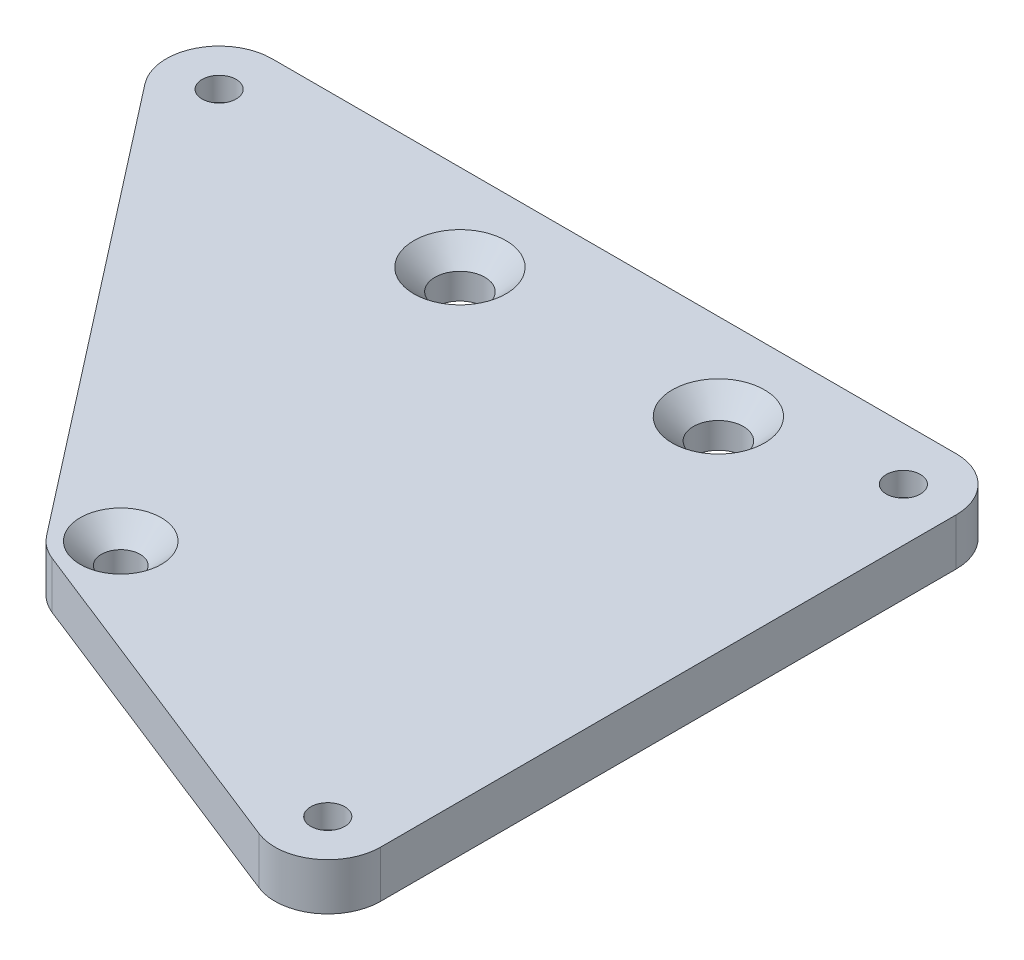
ISO-10303-21;
HEADER;
FILE_DESCRIPTION(('STEP AP214'),'2;1');
FILE_NAME('part.step','',(''),(''),'','','');
FILE_SCHEMA(('AUTOMOTIVE_DESIGN { 1 0 10303 214 1 1 1 1 }'));
ENDSEC;
DATA;
#1=APPLICATION_CONTEXT('core data for automotive mechanical design processes');
#2=APPLICATION_PROTOCOL_DEFINITION('international standard','automotive_design',2000,#1);
#3=PRODUCT_CONTEXT('',#1,'mechanical');
#4=PRODUCT('Part','Part','',(#3));
#5=PRODUCT_RELATED_PRODUCT_CATEGORY('part','',(#4));
#6=PRODUCT_DEFINITION_FORMATION('','',#4);
#7=PRODUCT_DEFINITION_CONTEXT('part definition',#1,'design');
#8=PRODUCT_DEFINITION('design','',#6,#7);
#9=PRODUCT_DEFINITION_SHAPE('','',#8);
#10=(LENGTH_UNIT() NAMED_UNIT(*) SI_UNIT(.MILLI.,.METRE.));
#11=(NAMED_UNIT(*) PLANE_ANGLE_UNIT() SI_UNIT($,.RADIAN.));
#12=(NAMED_UNIT(*) SI_UNIT($,.STERADIAN.) SOLID_ANGLE_UNIT());
#13=UNCERTAINTY_MEASURE_WITH_UNIT(LENGTH_MEASURE(1.E-05),#10,'distance_accuracy_value','');
#14=(GEOMETRIC_REPRESENTATION_CONTEXT(3) GLOBAL_UNCERTAINTY_ASSIGNED_CONTEXT((#13)) GLOBAL_UNIT_ASSIGNED_CONTEXT((#10,
#11,#12)) REPRESENTATION_CONTEXT('',''));
#15=CARTESIAN_POINT('',(0.,0.,0.));
#16=DIRECTION('',(0.,0.,1.));
#17=DIRECTION('',(1.,0.,0.));
#18=AXIS2_PLACEMENT_3D('',#15,#16,#17);
#19=CARTESIAN_POINT('',(29.125,-4.,-24.5));
#20=DIRECTION('',(0.,1.,0.));
#21=DIRECTION('',(0.,0.,1.));
#22=AXIS2_PLACEMENT_3D('',#19,#20,#21);
#23=CYLINDRICAL_SURFACE('',#22,3.);
#24=CARTESIAN_POINT('',(29.125,-4.,-24.5));
#25=DIRECTION('',(0.,1.,0.));
#26=DIRECTION('',(0.,0.,1.));
#27=AXIS2_PLACEMENT_3D('',#24,#25,#26);
#28=CIRCLE('',#27,3.);
#29=CARTESIAN_POINT('',(29.125,-4.,-21.5));
#30=VERTEX_POINT('',#29);
#31=EDGE_CURVE('E164',#30,#30,#28,.T.);
#32=ORIENTED_EDGE('',*,*,#31,.F.);
#33=EDGE_LOOP('',(#32));
#34=FACE_BOUND('',#33,.T.);
#35=CARTESIAN_POINT('',(29.125,-2.,-24.5));
#36=DIRECTION('',(0.,1.,0.));
#37=DIRECTION('',(0.,0.,1.));
#38=AXIS2_PLACEMENT_3D('',#35,#36,#37);
#39=CIRCLE('',#38,3.);
#40=CARTESIAN_POINT('',(29.125,-2.,-21.5));
#41=VERTEX_POINT('',#40);
#42=EDGE_CURVE('E181',#41,#41,#39,.F.);
#43=ORIENTED_EDGE('',*,*,#42,.F.);
#44=EDGE_LOOP('',(#43));
#45=FACE_BOUND('',#44,.T.);
#46=ADVANCED_FACE('F41',(#34,#45),#23,.F.);
#47=CARTESIAN_POINT('',(-29.125,-4.,-24.5));
#48=DIRECTION('',(0.,1.,0.));
#49=DIRECTION('',(0.,0.,1.));
#50=AXIS2_PLACEMENT_3D('',#47,#48,#49);
#51=CYLINDRICAL_SURFACE('',#50,3.);
#52=CARTESIAN_POINT('',(-29.125,-4.,-24.5));
#53=DIRECTION('',(0.,1.,0.));
#54=DIRECTION('',(0.,0.,1.));
#55=AXIS2_PLACEMENT_3D('',#52,#53,#54);
#56=CIRCLE('',#55,3.);
#57=CARTESIAN_POINT('',(-29.125,-4.,-21.5));
#58=VERTEX_POINT('',#57);
#59=EDGE_CURVE('E327',#58,#58,#56,.T.);
#60=ORIENTED_EDGE('',*,*,#59,.F.);
#61=EDGE_LOOP('',(#60));
#62=FACE_BOUND('',#61,.T.);
#63=CARTESIAN_POINT('',(-29.125,-2.,-24.5));
#64=DIRECTION('',(0.,1.,0.));
#65=DIRECTION('',(0.,0.,1.));
#66=AXIS2_PLACEMENT_3D('',#63,#64,#65);
#67=CIRCLE('',#66,3.);
#68=CARTESIAN_POINT('',(-29.125,-2.,-21.5));
#69=VERTEX_POINT('',#68);
#70=EDGE_CURVE('E178',#69,#69,#67,.F.);
#71=ORIENTED_EDGE('',*,*,#70,.F.);
#72=EDGE_LOOP('',(#71));
#73=FACE_BOUND('',#72,.T.);
#74=ADVANCED_FACE('F216',(#62,#73),#51,.F.);
#75=CARTESIAN_POINT('',(29.125,-4.,24.5));
#76=DIRECTION('',(0.,1.,0.));
#77=DIRECTION('',(0.,0.,1.));
#78=AXIS2_PLACEMENT_3D('',#75,#76,#77);
#79=CYLINDRICAL_SURFACE('',#78,3.);
#80=CARTESIAN_POINT('',(29.125,-4.,24.5));
#81=DIRECTION('',(0.,1.,0.));
#82=DIRECTION('',(0.,0.,1.));
#83=AXIS2_PLACEMENT_3D('',#80,#81,#82);
#84=CIRCLE('',#83,3.);
#85=CARTESIAN_POINT('',(29.125,-4.,27.5));
#86=VERTEX_POINT('',#85);
#87=EDGE_CURVE('E330',#86,#86,#84,.T.);
#88=ORIENTED_EDGE('',*,*,#87,.F.);
#89=EDGE_LOOP('',(#88));
#90=FACE_BOUND('',#89,.T.);
#91=CARTESIAN_POINT('',(29.125,-2.,24.5));
#92=DIRECTION('',(0.,1.,0.));
#93=DIRECTION('',(0.,0.,1.));
#94=AXIS2_PLACEMENT_3D('',#91,#92,#93);
#95=CIRCLE('',#94,3.);
#96=CARTESIAN_POINT('',(29.125,-2.,27.5));
#97=VERTEX_POINT('',#96);
#98=EDGE_CURVE('E166',#97,#97,#95,.F.);
#99=ORIENTED_EDGE('',*,*,#98,.F.);
#100=EDGE_LOOP('',(#99));
#101=FACE_BOUND('',#100,.T.);
#102=ADVANCED_FACE('F223',(#90,#101),#79,.F.);
#103=CARTESIAN_POINT('',(0.,-4.,-29.));
#104=DIRECTION('',(0.,0.,-1.));
#105=DIRECTION('',(-1.,0.,0.));
#106=AXIS2_PLACEMENT_3D('',#103,#104,#105);
#107=PLANE('',#106);
#108=DIRECTION('',(-1.,0.,0.));
#109=VECTOR('',#108,1.);
#110=CARTESIAN_POINT('',(0.,0.,-29.));
#111=LINE('',#110,#109);
#112=CARTESIAN_POINT('',(29.125,0.,-29.));
#113=VERTEX_POINT('',#112);
#114=CARTESIAN_POINT('',(-29.125,0.,-29.));
#115=VERTEX_POINT('',#114);
#116=EDGE_CURVE('E142',#113,#115,#111,.T.);
#117=ORIENTED_EDGE('',*,*,#116,.F.);
#118=DIRECTION('',(0.,1.,0.));
#119=VECTOR('',#118,1.);
#120=CARTESIAN_POINT('',(29.125,-4.,-29.));
#121=LINE('',#120,#119);
#122=CARTESIAN_POINT('',(29.125,-4.,-29.));
#123=VERTEX_POINT('',#122);
#124=EDGE_CURVE('E59',#123,#113,#121,.T.);
#125=ORIENTED_EDGE('',*,*,#124,.F.);
#126=DIRECTION('',(-1.,0.,0.));
#127=VECTOR('',#126,1.);
#128=CARTESIAN_POINT('',(0.,-4.,-29.));
#129=LINE('',#128,#127);
#130=CARTESIAN_POINT('',(-29.125,-4.,-29.));
#131=VERTEX_POINT('',#130);
#132=EDGE_CURVE('E342',#123,#131,#129,.T.);
#133=ORIENTED_EDGE('',*,*,#132,.T.);
#134=DIRECTION('',(0.,1.,0.));
#135=VECTOR('',#134,1.);
#136=CARTESIAN_POINT('',(-29.125,-4.,-29.));
#137=LINE('',#136,#135);
#138=EDGE_CURVE('E100',#131,#115,#137,.T.);
#139=ORIENTED_EDGE('',*,*,#138,.T.);
#140=EDGE_LOOP('',(#117,#125,#133,#139));
#141=FACE_BOUND('',#140,.T.);
#142=ADVANCED_FACE('F238',(#141),#107,.T.);
#143=CARTESIAN_POINT('',(29.125,-4.,-24.5));
#144=DIRECTION('',(0.,1.,0.));
#145=DIRECTION('',(0.,0.,1.));
#146=AXIS2_PLACEMENT_3D('',#143,#144,#145);
#147=CYLINDRICAL_SURFACE('',#146,4.50000000000001);
#148=CARTESIAN_POINT('',(29.125,0.,-24.5));
#149=DIRECTION('',(0.,1.,0.));
#150=DIRECTION('',(0.,0.,1.));
#151=AXIS2_PLACEMENT_3D('',#148,#149,#150);
#152=CIRCLE('',#151,4.50000000000001);
#153=CARTESIAN_POINT('',(33.625,0.,-24.5));
#154=VERTEX_POINT('',#153);
#155=EDGE_CURVE('E161',#154,#113,#152,.T.);
#156=ORIENTED_EDGE('',*,*,#155,.F.);
#157=DIRECTION('',(0.,1.,0.));
#158=VECTOR('',#157,1.);
#159=CARTESIAN_POINT('',(33.625,-4.,-24.5));
#160=LINE('',#159,#158);
#161=CARTESIAN_POINT('',(33.625,-4.,-24.5));
#162=VERTEX_POINT('',#161);
#163=EDGE_CURVE('E88',#162,#154,#160,.T.);
#164=ORIENTED_EDGE('',*,*,#163,.F.);
#165=CARTESIAN_POINT('',(29.125,-4.,-24.5));
#166=DIRECTION('',(0.,1.,0.));
#167=DIRECTION('',(0.,0.,1.));
#168=AXIS2_PLACEMENT_3D('',#165,#166,#167);
#169=CIRCLE('',#168,4.50000000000001);
#170=EDGE_CURVE('E132',#162,#123,#169,.T.);
#171=ORIENTED_EDGE('',*,*,#170,.T.);
#172=ORIENTED_EDGE('',*,*,#124,.T.);
#173=EDGE_LOOP('',(#156,#164,#171,#172));
#174=FACE_BOUND('',#173,.T.);
#175=ADVANCED_FACE('F254',(#174),#147,.T.);
#176=CARTESIAN_POINT('',(33.625,-4.,0.));
#177=DIRECTION('',(1.,0.,0.));
#178=DIRECTION('',(0.,0.,-1.));
#179=AXIS2_PLACEMENT_3D('',#176,#177,#178);
#180=PLANE('',#179);
#181=DIRECTION('',(0.,0.,-1.));
#182=VECTOR('',#181,1.);
#183=CARTESIAN_POINT('',(33.625,0.,0.));
#184=LINE('',#183,#182);
#185=CARTESIAN_POINT('',(33.625,0.,24.5));
#186=VERTEX_POINT('',#185);
#187=EDGE_CURVE('E119',#186,#154,#184,.T.);
#188=ORIENTED_EDGE('',*,*,#187,.F.);
#189=DIRECTION('',(0.,1.,0.));
#190=VECTOR('',#189,1.);
#191=CARTESIAN_POINT('',(33.625,-4.,24.5));
#192=LINE('',#191,#190);
#193=CARTESIAN_POINT('',(33.625,-4.,24.5));
#194=VERTEX_POINT('',#193);
#195=EDGE_CURVE('E114',#194,#186,#192,.T.);
#196=ORIENTED_EDGE('',*,*,#195,.F.);
#197=DIRECTION('',(0.,0.,-1.));
#198=VECTOR('',#197,1.);
#199=CARTESIAN_POINT('',(33.625,-4.,0.));
#200=LINE('',#199,#198);
#201=EDGE_CURVE('E117',#194,#162,#200,.T.);
#202=ORIENTED_EDGE('',*,*,#201,.T.);
#203=ORIENTED_EDGE('',*,*,#163,.T.);
#204=EDGE_LOOP('',(#188,#196,#202,#203));
#205=FACE_BOUND('',#204,.T.);
#206=ADVANCED_FACE('F116',(#205),#180,.T.);
#207=CARTESIAN_POINT('',(29.125,-4.,24.5));
#208=DIRECTION('',(0.,1.,0.));
#209=DIRECTION('',(0.,0.,1.));
#210=AXIS2_PLACEMENT_3D('',#207,#208,#209);
#211=CYLINDRICAL_SURFACE('',#210,4.5);
#212=CARTESIAN_POINT('',(29.125,0.,24.5));
#213=DIRECTION('',(0.,1.,0.));
#214=DIRECTION('',(0.,0.,1.));
#215=AXIS2_PLACEMENT_3D('',#212,#213,#214);
#216=CIRCLE('',#215,4.5);
#217=CARTESIAN_POINT('',(27.4723416023108,0.,28.6855370289304));
#218=VERTEX_POINT('',#217);
#219=EDGE_CURVE('E158',#218,#186,#216,.T.);
#220=ORIENTED_EDGE('',*,*,#219,.F.);
#221=DIRECTION('',(0.,1.,0.));
#222=VECTOR('',#221,1.);
#223=CARTESIAN_POINT('',(27.4723416023108,-4.,28.6855370289304));
#224=LINE('',#223,#222);
#225=CARTESIAN_POINT('',(27.4723416023108,-4.,28.6855370289304));
#226=VERTEX_POINT('',#225);
#227=EDGE_CURVE('E124',#226,#218,#224,.T.);
#228=ORIENTED_EDGE('',*,*,#227,.F.);
#229=CARTESIAN_POINT('',(29.125,-4.,24.5));
#230=DIRECTION('',(0.,1.,0.));
#231=DIRECTION('',(0.,0.,1.));
#232=AXIS2_PLACEMENT_3D('',#229,#230,#231);
#233=CIRCLE('',#232,4.5);
#234=EDGE_CURVE('E130',#226,#194,#233,.T.);
#235=ORIENTED_EDGE('',*,*,#234,.T.);
#236=ORIENTED_EDGE('',*,*,#195,.T.);
#237=EDGE_LOOP('',(#220,#228,#235,#236));
#238=FACE_BOUND('',#237,.T.);
#239=ADVANCED_FACE('F134',(#238),#211,.T.);
#240=CARTESIAN_POINT('',(-6.09337039552201,-4.,15.4321228495286));
#241=DIRECTION('',(-0.36725742170872,0.,0.930119339762303));
#242=DIRECTION('',(0.930119339762303,0.,0.36725742170872));
#243=AXIS2_PLACEMENT_3D('',#240,#241,#242);
#244=PLANE('',#243);
#245=DIRECTION('',(0.930119339762303,0.,0.36725742170872));
#246=VECTOR('',#245,1.);
#247=CARTESIAN_POINT('',(-6.09337039552201,0.,15.4321228495286));
#248=LINE('',#247,#246);
#249=CARTESIAN_POINT('',(-1.65265839768924,0.,17.1855370289304));
#250=VERTEX_POINT('',#249);
#251=EDGE_CURVE('E155',#250,#218,#248,.T.);
#252=ORIENTED_EDGE('',*,*,#251,.F.);
#253=DIRECTION('',(0.,1.,0.));
#254=VECTOR('',#253,1.);
#255=CARTESIAN_POINT('',(-1.65265839768924,-4.,17.1855370289304));
#256=LINE('',#255,#254);
#257=CARTESIAN_POINT('',(-1.65265839768924,-4.,17.1855370289304));
#258=VERTEX_POINT('',#257);
#259=EDGE_CURVE('E169',#258,#250,#256,.T.);
#260=ORIENTED_EDGE('',*,*,#259,.F.);
#261=DIRECTION('',(0.930119339762303,0.,0.36725742170872));
#262=VECTOR('',#261,1.);
#263=CARTESIAN_POINT('',(-6.09337039552201,-4.,15.4321228495286));
#264=LINE('',#263,#262);
#265=EDGE_CURVE('E135',#258,#226,#264,.T.);
#266=ORIENTED_EDGE('',*,*,#265,.T.);
#267=ORIENTED_EDGE('',*,*,#227,.T.);
#268=EDGE_LOOP('',(#252,#260,#266,#267));
#269=FACE_BOUND('',#268,.T.);
#270=ADVANCED_FACE('F263',(#269),#244,.T.);
#271=CARTESIAN_POINT('',(0.,-4.,13.));
#272=DIRECTION('',(0.,1.,0.));
#273=DIRECTION('',(0.,0.,1.));
#274=AXIS2_PLACEMENT_3D('',#271,#272,#273);
#275=CYLINDRICAL_SURFACE('',#274,4.5);
#276=CARTESIAN_POINT('',(0.,0.,13.));
#277=DIRECTION('',(0.,1.,0.));
#278=DIRECTION('',(0.,0.,1.));
#279=AXIS2_PLACEMENT_3D('',#276,#277,#278);
#280=CIRCLE('',#279,4.5);
#281=CARTESIAN_POINT('',(-3.55399781716934,0.,15.7602716380015));
#282=VERTEX_POINT('',#281);
#283=EDGE_CURVE('E152',#282,#250,#280,.T.);
#284=ORIENTED_EDGE('',*,*,#283,.F.);
#285=DIRECTION('',(0.,1.,0.));
#286=VECTOR('',#285,1.);
#287=CARTESIAN_POINT('',(-3.55399781716934,-4.,15.7602716380015));
#288=LINE('',#287,#286);
#289=CARTESIAN_POINT('',(-3.55399781716934,-4.,15.7602716380015));
#290=VERTEX_POINT('',#289);
#291=EDGE_CURVE('E171',#290,#282,#288,.T.);
#292=ORIENTED_EDGE('',*,*,#291,.F.);
#293=CARTESIAN_POINT('',(0.,-4.,13.));
#294=DIRECTION('',(0.,1.,0.));
#295=DIRECTION('',(0.,0.,1.));
#296=AXIS2_PLACEMENT_3D('',#293,#294,#295);
#297=CIRCLE('',#296,4.5);
#298=EDGE_CURVE('E137',#290,#258,#297,.T.);
#299=ORIENTED_EDGE('',*,*,#298,.T.);
#300=ORIENTED_EDGE('',*,*,#259,.T.);
#301=EDGE_LOOP('',(#284,#292,#299,#300));
#302=FACE_BOUND('',#301,.T.);
#303=ADVANCED_FACE('F259',(#302),#275,.T.);
#304=CARTESIAN_POINT('',(-9.85177519451619,-4.,7.65154540107424));
#305=DIRECTION('',(-0.789777292704297,0.,0.613393697333671));
#306=DIRECTION('',(0.613393697333671,0.,0.789777292704297));
#307=AXIS2_PLACEMENT_3D('',#304,#305,#306);
#308=PLANE('',#307);
#309=DIRECTION('',(0.613393697333671,0.,0.789777292704297));
#310=VECTOR('',#309,1.);
#311=CARTESIAN_POINT('',(-9.85177519451619,0.,7.65154540107424));
#312=LINE('',#311,#310);
#313=CARTESIAN_POINT('',(-32.6789978171693,0.,-21.7397283619985));
#314=VERTEX_POINT('',#313);
#315=EDGE_CURVE('E149',#314,#282,#312,.T.);
#316=ORIENTED_EDGE('',*,*,#315,.F.);
#317=DIRECTION('',(0.,1.,0.));
#318=VECTOR('',#317,1.);
#319=CARTESIAN_POINT('',(-32.6789978171693,-4.,-21.7397283619985));
#320=LINE('',#319,#318);
#321=CARTESIAN_POINT('',(-32.6789978171693,-4.,-21.7397283619985));
#322=VERTEX_POINT('',#321);
#323=EDGE_CURVE('E173',#322,#314,#320,.T.);
#324=ORIENTED_EDGE('',*,*,#323,.F.);
#325=DIRECTION('',(0.613393697333671,0.,0.789777292704297));
#326=VECTOR('',#325,1.);
#327=CARTESIAN_POINT('',(-9.85177519451619,-4.,7.65154540107424));
#328=LINE('',#327,#326);
#329=EDGE_CURVE('E346',#322,#290,#328,.T.);
#330=ORIENTED_EDGE('',*,*,#329,.T.);
#331=ORIENTED_EDGE('',*,*,#291,.T.);
#332=EDGE_LOOP('',(#316,#324,#330,#331));
#333=FACE_BOUND('',#332,.T.);
#334=ADVANCED_FACE('F250',(#333),#308,.T.);
#335=CARTESIAN_POINT('',(0.,-4.,13.));
#336=DIRECTION('',(0.,1.,0.));
#337=DIRECTION('',(0.,0.,1.));
#338=AXIS2_PLACEMENT_3D('',#335,#336,#337);
#339=CYLINDRICAL_SURFACE('',#338,1.65);
#340=CARTESIAN_POINT('',(0.,-1.8,13.));
#341=DIRECTION('',(0.,1.,0.));
#342=DIRECTION('',(0.,0.,1.));
#343=AXIS2_PLACEMENT_3D('',#340,#341,#342);
#344=CIRCLE('',#343,1.65);
#345=CARTESIAN_POINT('',(0.,-1.8,14.65));
#346=VERTEX_POINT('',#345);
#347=EDGE_CURVE('E184',#346,#346,#344,.T.);
#348=ORIENTED_EDGE('',*,*,#347,.T.);
#349=EDGE_LOOP('',(#348));
#350=FACE_BOUND('',#349,.T.);
#351=CARTESIAN_POINT('',(0.,-4.,13.));
#352=DIRECTION('',(0.,1.,0.));
#353=DIRECTION('',(0.,0.,1.));
#354=AXIS2_PLACEMENT_3D('',#351,#352,#353);
#355=CIRCLE('',#354,1.65);
#356=CARTESIAN_POINT('',(0.,-4.,14.65));
#357=VERTEX_POINT('',#356);
#358=EDGE_CURVE('E339',#357,#357,#355,.T.);
#359=ORIENTED_EDGE('',*,*,#358,.F.);
#360=EDGE_LOOP('',(#359));
#361=FACE_BOUND('',#360,.T.);
#362=ADVANCED_FACE('F247',(#350,#361),#339,.F.);
#363=CARTESIAN_POINT('',(-5.74999999999999,-4.,-21.625));
#364=DIRECTION('',(0.,1.,0.));
#365=DIRECTION('',(0.,0.,1.));
#366=AXIS2_PLACEMENT_3D('',#363,#364,#365);
#367=CYLINDRICAL_SURFACE('',#366,2.125);
#368=CARTESIAN_POINT('',(-5.74999999999999,-1.80000000000002,-21.625));
#369=DIRECTION('',(0.,1.,0.));
#370=DIRECTION('',(0.,0.,1.));
#371=AXIS2_PLACEMENT_3D('',#368,#369,#370);
#372=CIRCLE('',#371,2.125);
#373=CARTESIAN_POINT('',(-5.74999999999999,-1.80000000000002,-19.5));
#374=VERTEX_POINT('',#373);
#375=EDGE_CURVE('E51',#374,#374,#372,.T.);
#376=ORIENTED_EDGE('',*,*,#375,.T.);
#377=EDGE_LOOP('',(#376));
#378=FACE_BOUND('',#377,.T.);
#379=CARTESIAN_POINT('',(-5.74999999999999,-4.,-21.625));
#380=DIRECTION('',(0.,1.,0.));
#381=DIRECTION('',(0.,0.,1.));
#382=AXIS2_PLACEMENT_3D('',#379,#380,#381);
#383=CIRCLE('',#382,2.125);
#384=CARTESIAN_POINT('',(-5.74999999999999,-4.,-19.5));
#385=VERTEX_POINT('',#384);
#386=EDGE_CURVE('E336',#385,#385,#383,.T.);
#387=ORIENTED_EDGE('',*,*,#386,.F.);
#388=EDGE_LOOP('',(#387));
#389=FACE_BOUND('',#388,.T.);
#390=ADVANCED_FACE('F198',(#378,#389),#367,.F.);
#391=CARTESIAN_POINT('',(16.25,-4.,-21.625));
#392=DIRECTION('',(0.,1.,0.));
#393=DIRECTION('',(0.,0.,1.));
#394=AXIS2_PLACEMENT_3D('',#391,#392,#393);
#395=CYLINDRICAL_SURFACE('',#394,2.125);
#396=CARTESIAN_POINT('',(16.25,-1.80000000000002,-21.625));
#397=DIRECTION('',(0.,1.,0.));
#398=DIRECTION('',(0.,0.,1.));
#399=AXIS2_PLACEMENT_3D('',#396,#397,#398);
#400=CIRCLE('',#399,2.125);
#401=CARTESIAN_POINT('',(16.25,-1.80000000000002,-19.5));
#402=VERTEX_POINT('',#401);
#403=EDGE_CURVE('E11',#402,#402,#400,.T.);
#404=ORIENTED_EDGE('',*,*,#403,.T.);
#405=EDGE_LOOP('',(#404));
#406=FACE_BOUND('',#405,.T.);
#407=CARTESIAN_POINT('',(16.25,-4.,-21.625));
#408=DIRECTION('',(0.,1.,0.));
#409=DIRECTION('',(0.,0.,1.));
#410=AXIS2_PLACEMENT_3D('',#407,#408,#409);
#411=CIRCLE('',#410,2.125);
#412=CARTESIAN_POINT('',(16.25,-4.,-19.5));
#413=VERTEX_POINT('',#412);
#414=EDGE_CURVE('E333',#413,#413,#411,.T.);
#415=ORIENTED_EDGE('',*,*,#414,.F.);
#416=EDGE_LOOP('',(#415));
#417=FACE_BOUND('',#416,.T.);
#418=ADVANCED_FACE('F240',(#406,#417),#395,.F.);
#419=CARTESIAN_POINT('',(-29.125,-4.,-24.5));
#420=DIRECTION('',(0.,1.,0.));
#421=DIRECTION('',(0.,0.,1.));
#422=AXIS2_PLACEMENT_3D('',#419,#420,#421);
#423=CYLINDRICAL_SURFACE('',#422,4.5);
#424=CARTESIAN_POINT('',(-29.125,0.,-24.5));
#425=DIRECTION('',(0.,1.,0.));
#426=DIRECTION('',(0.,0.,1.));
#427=AXIS2_PLACEMENT_3D('',#424,#425,#426);
#428=CIRCLE('',#427,4.5);
#429=EDGE_CURVE('E145',#115,#314,#428,.T.);
#430=ORIENTED_EDGE('',*,*,#429,.F.);
#431=ORIENTED_EDGE('',*,*,#138,.F.);
#432=CARTESIAN_POINT('',(-29.125,-4.,-24.5));
#433=DIRECTION('',(0.,1.,0.));
#434=DIRECTION('',(0.,0.,1.));
#435=AXIS2_PLACEMENT_3D('',#432,#433,#434);
#436=CIRCLE('',#435,4.5);
#437=EDGE_CURVE('E344',#131,#322,#436,.T.);
#438=ORIENTED_EDGE('',*,*,#437,.T.);
#439=ORIENTED_EDGE('',*,*,#323,.T.);
#440=EDGE_LOOP('',(#430,#431,#438,#439));
#441=FACE_BOUND('',#440,.T.);
#442=ADVANCED_FACE('F243',(#441),#423,.T.);
#443=CARTESIAN_POINT('',(0.,-4.,0.));
#444=DIRECTION('',(0.,1.,0.));
#445=DIRECTION('',(0.,0.,1.));
#446=AXIS2_PLACEMENT_3D('',#443,#444,#445);
#447=PLANE('',#446);
#448=ORIENTED_EDGE('',*,*,#31,.T.);
#449=EDGE_LOOP('',(#448));
#450=FACE_BOUND('',#449,.T.);
#451=ORIENTED_EDGE('',*,*,#59,.T.);
#452=EDGE_LOOP('',(#451));
#453=FACE_BOUND('',#452,.T.);
#454=ORIENTED_EDGE('',*,*,#87,.T.);
#455=EDGE_LOOP('',(#454));
#456=FACE_BOUND('',#455,.T.);
#457=ORIENTED_EDGE('',*,*,#414,.T.);
#458=EDGE_LOOP('',(#457));
#459=FACE_BOUND('',#458,.T.);
#460=ORIENTED_EDGE('',*,*,#386,.T.);
#461=EDGE_LOOP('',(#460));
#462=FACE_BOUND('',#461,.T.);
#463=ORIENTED_EDGE('',*,*,#358,.T.);
#464=EDGE_LOOP('',(#463));
#465=FACE_BOUND('',#464,.T.);
#466=ORIENTED_EDGE('',*,*,#132,.F.);
#467=ORIENTED_EDGE('',*,*,#170,.F.);
#468=ORIENTED_EDGE('',*,*,#201,.F.);
#469=ORIENTED_EDGE('',*,*,#234,.F.);
#470=ORIENTED_EDGE('',*,*,#265,.F.);
#471=ORIENTED_EDGE('',*,*,#298,.F.);
#472=ORIENTED_EDGE('',*,*,#329,.F.);
#473=ORIENTED_EDGE('',*,*,#437,.F.);
#474=EDGE_LOOP('',(#466,#467,#468,#469,#470,#471,#472,#473));
#475=FACE_BOUND('',#474,.T.);
#476=ADVANCED_FACE('F128',(#450,#453,#456,#459,#462,#465,#475),#447,.F.);
#477=CARTESIAN_POINT('',(0.,0.,0.));
#478=DIRECTION('',(0.,1.,0.));
#479=DIRECTION('',(0.,0.,1.));
#480=AXIS2_PLACEMENT_3D('',#477,#478,#479);
#481=PLANE('',#480);
#482=CARTESIAN_POINT('',(0.,0.,13.));
#483=DIRECTION('',(0.,1.,0.));
#484=DIRECTION('',(0.,0.,1.));
#485=AXIS2_PLACEMENT_3D('',#482,#483,#484);
#486=CIRCLE('',#485,3.45000000000001);
#487=CARTESIAN_POINT('',(0.,0.,16.45));
#488=VERTEX_POINT('',#487);
#489=EDGE_CURVE('E193',#488,#488,#486,.F.);
#490=ORIENTED_EDGE('',*,*,#489,.T.);
#491=EDGE_LOOP('',(#490));
#492=FACE_BOUND('',#491,.T.);
#493=CARTESIAN_POINT('',(-5.74999999999999,0.,-21.625));
#494=DIRECTION('',(0.,1.,0.));
#495=DIRECTION('',(0.,0.,1.));
#496=AXIS2_PLACEMENT_3D('',#493,#494,#495);
#497=CIRCLE('',#496,3.92500000000001);
#498=CARTESIAN_POINT('',(-5.74999999999999,0.,-17.7));
#499=VERTEX_POINT('',#498);
#500=EDGE_CURVE('E190',#499,#499,#497,.F.);
#501=ORIENTED_EDGE('',*,*,#500,.T.);
#502=EDGE_LOOP('',(#501));
#503=FACE_BOUND('',#502,.T.);
#504=CARTESIAN_POINT('',(16.25,0.,-21.625));
#505=DIRECTION('',(0.,1.,0.));
#506=DIRECTION('',(0.,0.,1.));
#507=AXIS2_PLACEMENT_3D('',#504,#505,#506);
#508=CIRCLE('',#507,3.92500000000002);
#509=CARTESIAN_POINT('',(16.25,0.,-17.7));
#510=VERTEX_POINT('',#509);
#511=EDGE_CURVE('E187',#510,#510,#508,.F.);
#512=ORIENTED_EDGE('',*,*,#511,.T.);
#513=EDGE_LOOP('',(#512));
#514=FACE_BOUND('',#513,.T.);
#515=ORIENTED_EDGE('',*,*,#116,.T.);
#516=ORIENTED_EDGE('',*,*,#429,.T.);
#517=ORIENTED_EDGE('',*,*,#315,.T.);
#518=ORIENTED_EDGE('',*,*,#283,.T.);
#519=ORIENTED_EDGE('',*,*,#251,.T.);
#520=ORIENTED_EDGE('',*,*,#219,.T.);
#521=ORIENTED_EDGE('',*,*,#187,.T.);
#522=ORIENTED_EDGE('',*,*,#155,.T.);
#523=EDGE_LOOP('',(#515,#516,#517,#518,#519,#520,#521,#522));
#524=FACE_BOUND('',#523,.T.);
#525=CARTESIAN_POINT('',(29.125,0.,24.5));
#526=DIRECTION('',(0.,1.,0.));
#527=DIRECTION('',(0.,0.,1.));
#528=AXIS2_PLACEMENT_3D('',#525,#526,#527);
#529=CIRCLE('',#528,1.45);
#530=CARTESIAN_POINT('',(29.125,0.,25.95));
#531=VERTEX_POINT('',#530);
#532=EDGE_CURVE('E319',#531,#531,#529,.T.);
#533=ORIENTED_EDGE('',*,*,#532,.F.);
#534=EDGE_LOOP('',(#533));
#535=FACE_BOUND('',#534,.T.);
#536=CARTESIAN_POINT('',(-29.125,0.,-24.5));
#537=DIRECTION('',(0.,1.,0.));
#538=DIRECTION('',(0.,0.,1.));
#539=AXIS2_PLACEMENT_3D('',#536,#537,#538);
#540=CIRCLE('',#539,1.45);
#541=CARTESIAN_POINT('',(-29.125,0.,-23.05));
#542=VERTEX_POINT('',#541);
#543=EDGE_CURVE('E309',#542,#542,#540,.T.);
#544=ORIENTED_EDGE('',*,*,#543,.F.);
#545=EDGE_LOOP('',(#544));
#546=FACE_BOUND('',#545,.T.);
#547=CARTESIAN_POINT('',(29.125,0.,-24.5));
#548=DIRECTION('',(0.,1.,0.));
#549=DIRECTION('',(0.,0.,1.));
#550=AXIS2_PLACEMENT_3D('',#547,#548,#549);
#551=CIRCLE('',#550,1.45);
#552=CARTESIAN_POINT('',(29.125,0.,-23.05));
#553=VERTEX_POINT('',#552);
#554=EDGE_CURVE('E310',#553,#553,#551,.T.);
#555=ORIENTED_EDGE('',*,*,#554,.F.);
#556=EDGE_LOOP('',(#555));
#557=FACE_BOUND('',#556,.T.);
#558=ADVANCED_FACE('F274',(#492,#503,#514,#524,#535,#546,#557),#481,.T.);
#559=CARTESIAN_POINT('',(29.125,-2.,24.5));
#560=DIRECTION('',(0.,1.,0.));
#561=DIRECTION('',(0.,0.,1.));
#562=AXIS2_PLACEMENT_3D('',#559,#560,#561);
#563=CYLINDRICAL_SURFACE('',#562,1.45);
#564=CARTESIAN_POINT('',(29.125,-2.,24.5));
#565=DIRECTION('',(0.,1.,0.));
#566=DIRECTION('',(0.,0.,1.));
#567=AXIS2_PLACEMENT_3D('',#564,#565,#566);
#568=CIRCLE('',#567,1.45);
#569=CARTESIAN_POINT('',(29.125,-2.,25.95));
#570=VERTEX_POINT('',#569);
#571=EDGE_CURVE('E146',#570,#570,#568,.T.);
#572=ORIENTED_EDGE('',*,*,#571,.F.);
#573=EDGE_LOOP('',(#572));
#574=FACE_BOUND('',#573,.T.);
#575=ORIENTED_EDGE('',*,*,#532,.T.);
#576=EDGE_LOOP('',(#575));
#577=FACE_BOUND('',#576,.T.);
#578=ADVANCED_FACE('F277',(#574,#577),#563,.F.);
#579=CARTESIAN_POINT('',(0.,-2.,0.));
#580=DIRECTION('',(0.,1.,0.));
#581=DIRECTION('',(0.,0.,1.));
#582=AXIS2_PLACEMENT_3D('',#579,#580,#581);
#583=PLANE('',#582);
#584=ORIENTED_EDGE('',*,*,#571,.T.);
#585=EDGE_LOOP('',(#584));
#586=FACE_BOUND('',#585,.T.);
#587=ORIENTED_EDGE('',*,*,#98,.T.);
#588=EDGE_LOOP('',(#587));
#589=FACE_BOUND('',#588,.T.);
#590=ADVANCED_FACE('F283',(#586,#589),#583,.F.);
#591=CARTESIAN_POINT('',(-29.125,-2.,-24.5));
#592=DIRECTION('',(0.,1.,0.));
#593=DIRECTION('',(0.,0.,1.));
#594=AXIS2_PLACEMENT_3D('',#591,#592,#593);
#595=CYLINDRICAL_SURFACE('',#594,1.45);
#596=CARTESIAN_POINT('',(-29.125,-2.,-24.5));
#597=DIRECTION('',(0.,1.,0.));
#598=DIRECTION('',(0.,0.,1.));
#599=AXIS2_PLACEMENT_3D('',#596,#597,#598);
#600=CIRCLE('',#599,1.45);
#601=CARTESIAN_POINT('',(-29.125,-2.,-23.05));
#602=VERTEX_POINT('',#601);
#603=EDGE_CURVE('E313',#602,#602,#600,.T.);
#604=ORIENTED_EDGE('',*,*,#603,.F.);
#605=EDGE_LOOP('',(#604));
#606=FACE_BOUND('',#605,.T.);
#607=ORIENTED_EDGE('',*,*,#543,.T.);
#608=EDGE_LOOP('',(#607));
#609=FACE_BOUND('',#608,.T.);
#610=ADVANCED_FACE('F287',(#606,#609),#595,.F.);
#611=CARTESIAN_POINT('',(0.,-2.,0.));
#612=DIRECTION('',(0.,1.,0.));
#613=DIRECTION('',(0.,0.,1.));
#614=AXIS2_PLACEMENT_3D('',#611,#612,#613);
#615=PLANE('',#614);
#616=ORIENTED_EDGE('',*,*,#603,.T.);
#617=EDGE_LOOP('',(#616));
#618=FACE_BOUND('',#617,.T.);
#619=ORIENTED_EDGE('',*,*,#70,.T.);
#620=EDGE_LOOP('',(#619));
#621=FACE_BOUND('',#620,.T.);
#622=ADVANCED_FACE('F291',(#618,#621),#615,.F.);
#623=CARTESIAN_POINT('',(29.125,-2.,-24.5));
#624=DIRECTION('',(0.,1.,0.));
#625=DIRECTION('',(0.,0.,1.));
#626=AXIS2_PLACEMENT_3D('',#623,#624,#625);
#627=CYLINDRICAL_SURFACE('',#626,1.45);
#628=CARTESIAN_POINT('',(29.125,-2.,-24.5));
#629=DIRECTION('',(0.,1.,0.));
#630=DIRECTION('',(0.,0.,1.));
#631=AXIS2_PLACEMENT_3D('',#628,#629,#630);
#632=CIRCLE('',#631,1.45);
#633=CARTESIAN_POINT('',(29.125,-2.,-23.05));
#634=VERTEX_POINT('',#633);
#635=EDGE_CURVE('E307',#634,#634,#632,.T.);
#636=ORIENTED_EDGE('',*,*,#635,.F.);
#637=EDGE_LOOP('',(#636));
#638=FACE_BOUND('',#637,.T.);
#639=ORIENTED_EDGE('',*,*,#554,.T.);
#640=EDGE_LOOP('',(#639));
#641=FACE_BOUND('',#640,.T.);
#642=ADVANCED_FACE('F295',(#638,#641),#627,.F.);
#643=CARTESIAN_POINT('',(0.,-2.,0.));
#644=DIRECTION('',(0.,1.,0.));
#645=DIRECTION('',(0.,0.,1.));
#646=AXIS2_PLACEMENT_3D('',#643,#644,#645);
#647=PLANE('',#646);
#648=ORIENTED_EDGE('',*,*,#635,.T.);
#649=EDGE_LOOP('',(#648));
#650=FACE_BOUND('',#649,.T.);
#651=ORIENTED_EDGE('',*,*,#42,.T.);
#652=EDGE_LOOP('',(#651));
#653=FACE_BOUND('',#652,.T.);
#654=ADVANCED_FACE('F210',(#650,#653),#647,.F.);
#655=CARTESIAN_POINT('',(0.,-1.8,13.));
#656=DIRECTION('',(0.,1.,0.));
#657=DIRECTION('',(0.,0.,1.));
#658=AXIS2_PLACEMENT_3D('',#655,#656,#657);
#659=CONICAL_SURFACE('',#658,1.65,0.78539816339745);
#660=ORIENTED_EDGE('',*,*,#489,.F.);
#661=EDGE_LOOP('',(#660));
#662=FACE_BOUND('',#661,.T.);
#663=ORIENTED_EDGE('',*,*,#347,.F.);
#664=EDGE_LOOP('',(#663));
#665=FACE_BOUND('',#664,.T.);
#666=ADVANCED_FACE('F203',(#662,#665),#659,.F.);
#667=CARTESIAN_POINT('',(-5.74999999999999,-1.80000000000002,-21.625));
#668=DIRECTION('',(0.,1.,0.));
#669=DIRECTION('',(0.,0.,1.));
#670=AXIS2_PLACEMENT_3D('',#667,#668,#669);
#671=CONICAL_SURFACE('',#670,2.125,0.785398163397446);
#672=CARTESIAN_POINT('',(-5.74999999999999,0.,-17.7));
#673=CARTESIAN_POINT('',(-5.74999999999999,-0.0187500000000003,-17.71875));
#674=CARTESIAN_POINT('',(-5.74999999999999,-0.0375000000000005,-17.7375));
#675=CARTESIAN_POINT('',(-5.74999999999999,-0.075000000000001,-17.775));
#676=CARTESIAN_POINT('',(-5.74999999999999,-0.0937500000000012,-17.79375));
#677=CARTESIAN_POINT('',(-5.74999999999999,-0.131250000000001,-17.83125));
#678=CARTESIAN_POINT('',(-5.74999999999999,-0.150000000000001,-17.85));
#679=CARTESIAN_POINT('',(-5.74999999999999,-0.187500000000002,-17.8875));
#680=CARTESIAN_POINT('',(-5.74999999999999,-0.206250000000002,-17.90625));
#681=CARTESIAN_POINT('',(-5.74999999999999,-0.243750000000003,-17.94375));
#682=CARTESIAN_POINT('',(-5.74999999999999,-0.262500000000003,-17.9625));
#683=CARTESIAN_POINT('',(-5.74999999999999,-0.300000000000003,-18.));
#684=CARTESIAN_POINT('',(-5.74999999999999,-0.318750000000003,-18.01875));
#685=CARTESIAN_POINT('',(-5.74999999999999,-0.356250000000004,-18.05625));
#686=CARTESIAN_POINT('',(-5.74999999999999,-0.375000000000004,-18.075));
#687=CARTESIAN_POINT('',(-5.74999999999999,-0.412500000000004,-18.1125));
#688=CARTESIAN_POINT('',(-5.74999999999999,-0.431250000000004,-18.13125));
#689=CARTESIAN_POINT('',(-5.74999999999999,-0.468750000000005,-18.16875));
#690=CARTESIAN_POINT('',(-5.74999999999999,-0.487500000000005,-18.1875));
#691=CARTESIAN_POINT('',(-5.74999999999999,-0.525000000000005,-18.225));
#692=CARTESIAN_POINT('',(-5.74999999999999,-0.543750000000005,-18.24375));
#693=CARTESIAN_POINT('',(-5.74999999999999,-0.581250000000006,-18.28125));
#694=CARTESIAN_POINT('',(-5.74999999999999,-0.600000000000006,-18.3));
#695=CARTESIAN_POINT('',(-5.74999999999999,-0.637500000000006,-18.3375));
#696=CARTESIAN_POINT('',(-5.74999999999999,-0.656250000000006,-18.35625));
#697=CARTESIAN_POINT('',(-5.74999999999999,-0.693750000000007,-18.39375));
#698=CARTESIAN_POINT('',(-5.74999999999999,-0.712500000000007,-18.4125));
#699=CARTESIAN_POINT('',(-5.74999999999999,-0.750000000000008,-18.45));
#700=CARTESIAN_POINT('',(-5.74999999999999,-0.768750000000007,-18.46875));
#701=CARTESIAN_POINT('',(-5.74999999999999,-0.806250000000008,-18.50625));
#702=CARTESIAN_POINT('',(-5.74999999999999,-0.825000000000008,-18.525));
#703=CARTESIAN_POINT('',(-5.74999999999999,-0.862500000000008,-18.5625));
#704=CARTESIAN_POINT('',(-5.74999999999999,-0.881250000000008,-18.58125));
#705=CARTESIAN_POINT('',(-5.74999999999999,-0.918750000000009,-18.61875));
#706=CARTESIAN_POINT('',(-5.74999999999999,-0.937500000000009,-18.6375));
#707=CARTESIAN_POINT('',(-5.74999999999999,-0.975000000000009,-18.675));
#708=CARTESIAN_POINT('',(-5.74999999999999,-0.993750000000009,-18.69375));
#709=CARTESIAN_POINT('',(-5.74999999999999,-1.03125000000001,-18.73125));
#710=CARTESIAN_POINT('',(-5.74999999999999,-1.05000000000001,-18.75));
#711=CARTESIAN_POINT('',(-5.74999999999999,-1.08750000000001,-18.7875));
#712=CARTESIAN_POINT('',(-5.74999999999999,-1.10625000000001,-18.80625));
#713=CARTESIAN_POINT('',(-5.74999999999999,-1.14375000000001,-18.84375));
#714=CARTESIAN_POINT('',(-5.74999999999999,-1.16250000000001,-18.8625));
#715=CARTESIAN_POINT('',(-5.74999999999999,-1.20000000000001,-18.9));
#716=CARTESIAN_POINT('',(-5.74999999999999,-1.21875000000001,-18.91875));
#717=CARTESIAN_POINT('',(-5.74999999999999,-1.25625000000001,-18.95625));
#718=CARTESIAN_POINT('',(-5.74999999999999,-1.27500000000001,-18.975));
#719=CARTESIAN_POINT('',(-5.74999999999999,-1.31250000000001,-19.0125));
#720=CARTESIAN_POINT('',(-5.74999999999999,-1.33125000000001,-19.03125));
#721=CARTESIAN_POINT('',(-5.74999999999999,-1.36875000000001,-19.06875));
#722=CARTESIAN_POINT('',(-5.74999999999999,-1.38750000000001,-19.0875));
#723=CARTESIAN_POINT('',(-5.74999999999999,-1.42500000000001,-19.125));
#724=CARTESIAN_POINT('',(-5.74999999999999,-1.44375000000001,-19.14375));
#725=CARTESIAN_POINT('',(-5.74999999999999,-1.48125000000001,-19.18125));
#726=CARTESIAN_POINT('',(-5.74999999999999,-1.50000000000001,-19.2));
#727=CARTESIAN_POINT('',(-5.74999999999999,-1.53750000000001,-19.2375));
#728=CARTESIAN_POINT('',(-5.74999999999999,-1.55625000000001,-19.25625));
#729=CARTESIAN_POINT('',(-5.74999999999999,-1.59375000000002,-19.29375));
#730=CARTESIAN_POINT('',(-5.74999999999999,-1.61250000000002,-19.3125));
#731=CARTESIAN_POINT('',(-5.74999999999999,-1.65000000000002,-19.35));
#732=CARTESIAN_POINT('',(-5.74999999999999,-1.66875000000002,-19.36875));
#733=CARTESIAN_POINT('',(-5.74999999999999,-1.70625000000002,-19.40625));
#734=CARTESIAN_POINT('',(-5.74999999999999,-1.72500000000002,-19.425));
#735=CARTESIAN_POINT('',(-5.74999999999999,-1.76250000000002,-19.4625));
#736=CARTESIAN_POINT('',(-5.74999999999999,-1.78125000000002,-19.48125));
#737=CARTESIAN_POINT('',(-5.74999999999999,-1.80000000000002,-19.5));
#738=B_SPLINE_CURVE_WITH_KNOTS('',3,(#672,#673,#674,#675,#676,#677,#678,#679,#680,#681,#682,
#683,#684,#685,#686,#687,#688,#689,#690,#691,#692,#693,#694,#695,#696,#697,#698,#699,#700,#701,
#702,#703,#704,#705,#706,#707,#708,#709,#710,#711,#712,#713,#714,#715,#716,#717,#718,#719,#720,
#721,#722,#723,#724,#725,#726,#727,#728,#729,#730,#731,#732,#733,#734,#735,#736,#737),
.UNSPECIFIED.,.F.,.F.,(4,2,2,2,2,2,2,2,2,2,2,2,2,2,2,2,2,2,2,2,2,2,2,2,2,2,2,2,2,2,2,2,4),(0.,
0.0795495128834875,0.159099025766975,0.238648538650462,0.318198051533948,0.397747564417435,
0.477297077300923,0.55684659018441,0.636396103067897,0.715945615951385,0.795495128834872,
0.87504464171836,0.954594154601847,1.03414366748533,1.11369318036882,1.19324269325231,
1.27279220613579,1.35234171901928,1.43189123190277,1.51144074478626,1.59099025766974,
1.67053977055323,1.75008928343672,1.8296387963202,1.90918830920369,1.98873782208718,
2.06828733497067,2.14783684785415,2.22738636073764,2.30693587362113,2.38648538650461,
2.4660348993881,2.54558441227159),.UNSPECIFIED.);
#739=EDGE_CURVE('BSEAM201',#499,#374,#738,.T.);
#740=ORIENTED_EDGE('',*,*,#500,.F.);
#741=ORIENTED_EDGE('',*,*,#375,.F.);
#742=ORIENTED_EDGE('',*,*,#739,.T.);
#743=ORIENTED_EDGE('',*,*,#739,.F.);
#744=EDGE_LOOP('',(#740,#742,#741,#743));
#745=FACE_BOUND('',#744,.T.);
#746=ADVANCED_FACE('F201',(#745),#671,.F.);
#747=CARTESIAN_POINT('',(16.25,-1.80000000000002,-21.625));
#748=DIRECTION('',(0.,1.,0.));
#749=DIRECTION('',(0.,0.,1.));
#750=AXIS2_PLACEMENT_3D('',#747,#748,#749);
#751=CONICAL_SURFACE('',#750,2.125,0.785398163397447);
#752=ORIENTED_EDGE('',*,*,#511,.F.);
#753=EDGE_LOOP('',(#752));
#754=FACE_BOUND('',#753,.T.);
#755=ORIENTED_EDGE('',*,*,#403,.F.);
#756=EDGE_LOOP('',(#755));
#757=FACE_BOUND('',#756,.T.);
#758=ADVANCED_FACE('F44',(#754,#757),#751,.F.);
#759=CLOSED_SHELL('',(#46,#74,#102,#142,#175,#206,#239,#270,#303,#334,#362,#390,#418,#442,#476,
#558,#578,#590,#610,#622,#642,#654,#666,#746,#758));
#760=MANIFOLD_SOLID_BREP('B2',#759);
#761=ADVANCED_BREP_SHAPE_REPRESENTATION('',(#18,#760),#14);
#762=SHAPE_DEFINITION_REPRESENTATION(#9,#761);
ENDSEC;
END-ISO-10303-21;
